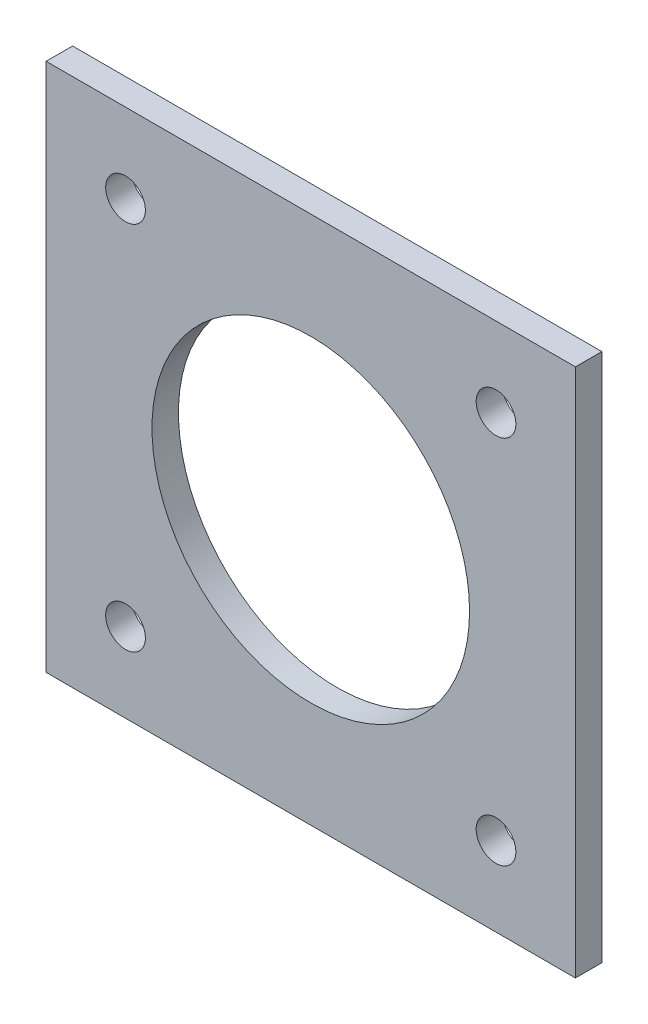
ISO-10303-21;
HEADER;
FILE_DESCRIPTION(('STEP AP214'),'2;1');
FILE_NAME('part.step','',(''),(''),'','','');
FILE_SCHEMA(('AUTOMOTIVE_DESIGN { 1 0 10303 214 1 1 1 1 }'));
ENDSEC;
DATA;
#1=APPLICATION_CONTEXT('core data for automotive mechanical design processes');
#2=APPLICATION_PROTOCOL_DEFINITION('international standard','automotive_design',2000,#1);
#3=PRODUCT_CONTEXT('',#1,'mechanical');
#4=PRODUCT('Part','Part','',(#3));
#5=PRODUCT_RELATED_PRODUCT_CATEGORY('part','',(#4));
#6=PRODUCT_DEFINITION_FORMATION('','',#4);
#7=PRODUCT_DEFINITION_CONTEXT('part definition',#1,'design');
#8=PRODUCT_DEFINITION('design','',#6,#7);
#9=PRODUCT_DEFINITION_SHAPE('','',#8);
#10=(LENGTH_UNIT() NAMED_UNIT(*) SI_UNIT(.MILLI.,.METRE.));
#11=(NAMED_UNIT(*) PLANE_ANGLE_UNIT() SI_UNIT($,.RADIAN.));
#12=(NAMED_UNIT(*) SI_UNIT($,.STERADIAN.) SOLID_ANGLE_UNIT());
#13=UNCERTAINTY_MEASURE_WITH_UNIT(LENGTH_MEASURE(1.E-05),#10,'distance_accuracy_value','');
#14=(GEOMETRIC_REPRESENTATION_CONTEXT(3) GLOBAL_UNCERTAINTY_ASSIGNED_CONTEXT((#13)) GLOBAL_UNIT_ASSIGNED_CONTEXT((#10,
#11,#12)) REPRESENTATION_CONTEXT('',''));
#15=CARTESIAN_POINT('',(0.,0.,0.));
#16=DIRECTION('',(0.,0.,1.));
#17=DIRECTION('',(1.,0.,0.));
#18=AXIS2_PLACEMENT_3D('',#15,#16,#17);
#19=CARTESIAN_POINT('',(-16.8432578160716,-11.7743628950051,2.));
#20=DIRECTION('',(0.,0.,1.));
#21=DIRECTION('',(1.,0.,0.));
#22=AXIS2_PLACEMENT_3D('',#19,#20,#21);
#23=PLANE('',#22);
#24=CARTESIAN_POINT('',(-10.8432578160716,-5.77436289500511,2.));
#25=DIRECTION('',(0.,0.,1.));
#26=DIRECTION('',(1.,0.,0.));
#27=AXIS2_PLACEMENT_3D('',#24,#25,#26);
#28=CIRCLE('',#27,1.5);
#29=CARTESIAN_POINT('',(-9.34325781607163,-5.77436289500511,2.));
#30=VERTEX_POINT('',#29);
#31=EDGE_CURVE('E125',#30,#30,#28,.T.);
#32=ORIENTED_EDGE('',*,*,#31,.F.);
#33=EDGE_LOOP('',(#32));
#34=FACE_BOUND('',#33,.T.);
#35=CARTESIAN_POINT('',(-10.8432578160716,22.2256371049949,2.));
#36=DIRECTION('',(0.,0.,1.));
#37=DIRECTION('',(1.,0.,0.));
#38=AXIS2_PLACEMENT_3D('',#35,#36,#37);
#39=CIRCLE('',#38,1.5);
#40=CARTESIAN_POINT('',(-9.34325781607162,22.2256371049949,2.));
#41=VERTEX_POINT('',#40);
#42=EDGE_CURVE('E113',#41,#41,#39,.T.);
#43=ORIENTED_EDGE('',*,*,#42,.F.);
#44=EDGE_LOOP('',(#43));
#45=FACE_BOUND('',#44,.T.);
#46=DIRECTION('',(0.,-1.,0.));
#47=VECTOR('',#46,1.);
#48=CARTESIAN_POINT('',(-16.8432578160716,28.2256371049949,2.));
#49=LINE('',#48,#47);
#50=CARTESIAN_POINT('',(-16.8432578160716,28.2256371049949,2.));
#51=VERTEX_POINT('',#50);
#52=CARTESIAN_POINT('',(-16.8432578160716,-11.7743628950051,2.));
#53=VERTEX_POINT('',#52);
#54=EDGE_CURVE('E83',#51,#53,#49,.T.);
#55=ORIENTED_EDGE('',*,*,#54,.T.);
#56=DIRECTION('',(1.,0.,0.));
#57=VECTOR('',#56,1.);
#58=CARTESIAN_POINT('',(-16.8432578160716,-11.7743628950051,2.));
#59=LINE('',#58,#57);
#60=CARTESIAN_POINT('',(23.1567421839284,-11.7743628950051,2.));
#61=VERTEX_POINT('',#60);
#62=EDGE_CURVE('E78',#53,#61,#59,.T.);
#63=ORIENTED_EDGE('',*,*,#62,.T.);
#64=DIRECTION('',(0.,1.,0.));
#65=VECTOR('',#64,1.);
#66=CARTESIAN_POINT('',(23.1567421839284,28.2256371049949,2.));
#67=LINE('',#66,#65);
#68=CARTESIAN_POINT('',(23.1567421839284,28.2256371049949,2.));
#69=VERTEX_POINT('',#68);
#70=EDGE_CURVE('E81',#61,#69,#67,.T.);
#71=ORIENTED_EDGE('',*,*,#70,.T.);
#72=DIRECTION('',(-1.,0.,0.));
#73=VECTOR('',#72,1.);
#74=CARTESIAN_POINT('',(-16.8432578160716,28.2256371049949,2.));
#75=LINE('',#74,#73);
#76=EDGE_CURVE('E48',#69,#51,#75,.T.);
#77=ORIENTED_EDGE('',*,*,#76,.T.);
#78=EDGE_LOOP('',(#55,#63,#71,#77));
#79=FACE_BOUND('',#78,.T.);
#80=CARTESIAN_POINT('',(3.15674218392838,8.22563710499489,2.));
#81=DIRECTION('',(0.,0.,1.));
#82=DIRECTION('',(1.,0.,0.));
#83=AXIS2_PLACEMENT_3D('',#80,#81,#82);
#84=CIRCLE('',#83,12.);
#85=CARTESIAN_POINT('',(15.1567421839284,8.22563710499489,2.));
#86=VERTEX_POINT('',#85);
#87=EDGE_CURVE('E98',#86,#86,#84,.T.);
#88=ORIENTED_EDGE('',*,*,#87,.F.);
#89=EDGE_LOOP('',(#88));
#90=FACE_BOUND('',#89,.T.);
#91=CARTESIAN_POINT('',(17.1567421839284,22.2256371049949,2.));
#92=DIRECTION('',(0.,0.,1.));
#93=DIRECTION('',(1.,0.,0.));
#94=AXIS2_PLACEMENT_3D('',#91,#92,#93);
#95=CIRCLE('',#94,1.5);
#96=CARTESIAN_POINT('',(18.6567421839284,22.2256371049949,2.));
#97=VERTEX_POINT('',#96);
#98=EDGE_CURVE('E119',#97,#97,#95,.T.);
#99=ORIENTED_EDGE('',*,*,#98,.F.);
#100=EDGE_LOOP('',(#99));
#101=FACE_BOUND('',#100,.T.);
#102=CARTESIAN_POINT('',(17.1567421839284,-5.77436289500511,2.));
#103=DIRECTION('',(0.,0.,1.));
#104=DIRECTION('',(1.,0.,0.));
#105=AXIS2_PLACEMENT_3D('',#102,#103,#104);
#106=CIRCLE('',#105,1.5);
#107=CARTESIAN_POINT('',(18.6567421839284,-5.77436289500511,2.));
#108=VERTEX_POINT('',#107);
#109=EDGE_CURVE('E131',#108,#108,#106,.T.);
#110=ORIENTED_EDGE('',*,*,#109,.F.);
#111=EDGE_LOOP('',(#110));
#112=FACE_BOUND('',#111,.T.);
#113=ADVANCED_FACE('F31',(#34,#45,#79,#90,#101,#112),#23,.T.);
#114=CARTESIAN_POINT('',(-16.8432578160716,-11.7743628950051,0.));
#115=DIRECTION('',(0.,0.,1.));
#116=DIRECTION('',(1.,0.,0.));
#117=AXIS2_PLACEMENT_3D('',#114,#115,#116);
#118=PLANE('',#117);
#119=CARTESIAN_POINT('',(-10.8432578160716,-5.77436289500511,0.));
#120=DIRECTION('',(0.,0.,1.));
#121=DIRECTION('',(1.,0.,0.));
#122=AXIS2_PLACEMENT_3D('',#119,#120,#121);
#123=CIRCLE('',#122,1.5);
#124=CARTESIAN_POINT('',(-9.34325781607163,-5.77436289500511,0.));
#125=VERTEX_POINT('',#124);
#126=EDGE_CURVE('E128',#125,#125,#123,.T.);
#127=ORIENTED_EDGE('',*,*,#126,.T.);
#128=EDGE_LOOP('',(#127));
#129=FACE_BOUND('',#128,.T.);
#130=CARTESIAN_POINT('',(-10.8432578160716,22.2256371049949,0.));
#131=DIRECTION('',(0.,0.,1.));
#132=DIRECTION('',(1.,0.,0.));
#133=AXIS2_PLACEMENT_3D('',#130,#131,#132);
#134=CIRCLE('',#133,1.5);
#135=CARTESIAN_POINT('',(-9.34325781607162,22.2256371049949,0.));
#136=VERTEX_POINT('',#135);
#137=EDGE_CURVE('E116',#136,#136,#134,.T.);
#138=ORIENTED_EDGE('',*,*,#137,.T.);
#139=EDGE_LOOP('',(#138));
#140=FACE_BOUND('',#139,.T.);
#141=DIRECTION('',(0.,-1.,0.));
#142=VECTOR('',#141,1.);
#143=CARTESIAN_POINT('',(-16.8432578160716,28.2256371049949,0.));
#144=LINE('',#143,#142);
#145=CARTESIAN_POINT('',(-16.8432578160716,28.2256371049949,0.));
#146=VERTEX_POINT('',#145);
#147=CARTESIAN_POINT('',(-16.8432578160716,-11.7743628950051,0.));
#148=VERTEX_POINT('',#147);
#149=EDGE_CURVE('E95',#146,#148,#144,.T.);
#150=ORIENTED_EDGE('',*,*,#149,.F.);
#151=DIRECTION('',(-1.,0.,0.));
#152=VECTOR('',#151,1.);
#153=CARTESIAN_POINT('',(-16.8432578160716,28.2256371049949,0.));
#154=LINE('',#153,#152);
#155=CARTESIAN_POINT('',(23.1567421839284,28.2256371049949,0.));
#156=VERTEX_POINT('',#155);
#157=EDGE_CURVE('E71',#156,#146,#154,.T.);
#158=ORIENTED_EDGE('',*,*,#157,.F.);
#159=DIRECTION('',(0.,1.,0.));
#160=VECTOR('',#159,1.);
#161=CARTESIAN_POINT('',(23.1567421839284,28.2256371049949,0.));
#162=LINE('',#161,#160);
#163=CARTESIAN_POINT('',(23.1567421839284,-11.7743628950051,0.));
#164=VERTEX_POINT('',#163);
#165=EDGE_CURVE('E65',#164,#156,#162,.T.);
#166=ORIENTED_EDGE('',*,*,#165,.F.);
#167=DIRECTION('',(1.,0.,0.));
#168=VECTOR('',#167,1.);
#169=CARTESIAN_POINT('',(-16.8432578160716,-11.7743628950051,0.));
#170=LINE('',#169,#168);
#171=EDGE_CURVE('E87',#148,#164,#170,.T.);
#172=ORIENTED_EDGE('',*,*,#171,.F.);
#173=EDGE_LOOP('',(#150,#158,#166,#172));
#174=FACE_BOUND('',#173,.T.);
#175=CARTESIAN_POINT('',(3.15674218392838,8.22563710499489,0.));
#176=DIRECTION('',(0.,0.,1.));
#177=DIRECTION('',(1.,0.,0.));
#178=AXIS2_PLACEMENT_3D('',#175,#176,#177);
#179=CIRCLE('',#178,12.);
#180=CARTESIAN_POINT('',(15.1567421839284,8.22563710499489,0.));
#181=VERTEX_POINT('',#180);
#182=EDGE_CURVE('E110',#181,#181,#179,.T.);
#183=ORIENTED_EDGE('',*,*,#182,.T.);
#184=EDGE_LOOP('',(#183));
#185=FACE_BOUND('',#184,.T.);
#186=CARTESIAN_POINT('',(17.1567421839284,22.2256371049949,0.));
#187=DIRECTION('',(0.,0.,1.));
#188=DIRECTION('',(1.,0.,0.));
#189=AXIS2_PLACEMENT_3D('',#186,#187,#188);
#190=CIRCLE('',#189,1.5);
#191=CARTESIAN_POINT('',(18.6567421839284,22.2256371049949,0.));
#192=VERTEX_POINT('',#191);
#193=EDGE_CURVE('E122',#192,#192,#190,.T.);
#194=ORIENTED_EDGE('',*,*,#193,.T.);
#195=EDGE_LOOP('',(#194));
#196=FACE_BOUND('',#195,.T.);
#197=CARTESIAN_POINT('',(17.1567421839284,-5.77436289500511,0.));
#198=DIRECTION('',(0.,0.,1.));
#199=DIRECTION('',(1.,0.,0.));
#200=AXIS2_PLACEMENT_3D('',#197,#198,#199);
#201=CIRCLE('',#200,1.5);
#202=CARTESIAN_POINT('',(18.6567421839284,-5.77436289500511,0.));
#203=VERTEX_POINT('',#202);
#204=EDGE_CURVE('E134',#203,#203,#201,.T.);
#205=ORIENTED_EDGE('',*,*,#204,.T.);
#206=EDGE_LOOP('',(#205));
#207=FACE_BOUND('',#206,.T.);
#208=ADVANCED_FACE('F106',(#129,#140,#174,#185,#196,#207),#118,.F.);
#209=CARTESIAN_POINT('',(-16.8432578160716,28.2256371049949,2.));
#210=DIRECTION('',(1.,0.,0.));
#211=DIRECTION('',(0.,1.,0.));
#212=AXIS2_PLACEMENT_3D('',#209,#210,#211);
#213=PLANE('',#212);
#214=ORIENTED_EDGE('',*,*,#149,.T.);
#215=DIRECTION('',(0.,0.,-1.));
#216=VECTOR('',#215,1.);
#217=CARTESIAN_POINT('',(-16.8432578160716,-11.7743628950051,2.));
#218=LINE('',#217,#216);
#219=EDGE_CURVE('E11',#53,#148,#218,.T.);
#220=ORIENTED_EDGE('',*,*,#219,.F.);
#221=ORIENTED_EDGE('',*,*,#54,.F.);
#222=DIRECTION('',(0.,0.,-1.));
#223=VECTOR('',#222,1.);
#224=CARTESIAN_POINT('',(-16.8432578160716,28.2256371049949,2.));
#225=LINE('',#224,#223);
#226=EDGE_CURVE('E91',#51,#146,#225,.T.);
#227=ORIENTED_EDGE('',*,*,#226,.T.);
#228=EDGE_LOOP('',(#214,#220,#221,#227));
#229=FACE_BOUND('',#228,.T.);
#230=ADVANCED_FACE('F33',(#229),#213,.F.);
#231=CARTESIAN_POINT('',(-16.8432578160716,-11.7743628950051,2.));
#232=DIRECTION('',(0.,1.,0.));
#233=DIRECTION('',(0.,0.,1.));
#234=AXIS2_PLACEMENT_3D('',#231,#232,#233);
#235=PLANE('',#234);
#236=ORIENTED_EDGE('',*,*,#171,.T.);
#237=DIRECTION('',(0.,0.,-1.));
#238=VECTOR('',#237,1.);
#239=CARTESIAN_POINT('',(23.1567421839284,-11.7743628950051,2.));
#240=LINE('',#239,#238);
#241=EDGE_CURVE('E40',#61,#164,#240,.T.);
#242=ORIENTED_EDGE('',*,*,#241,.F.);
#243=ORIENTED_EDGE('',*,*,#62,.F.);
#244=ORIENTED_EDGE('',*,*,#219,.T.);
#245=EDGE_LOOP('',(#236,#242,#243,#244));
#246=FACE_BOUND('',#245,.T.);
#247=ADVANCED_FACE('F86',(#246),#235,.F.);
#248=CARTESIAN_POINT('',(23.1567421839284,28.2256371049949,2.));
#249=DIRECTION('',(-1.,0.,0.));
#250=DIRECTION('',(0.,-1.,0.));
#251=AXIS2_PLACEMENT_3D('',#248,#249,#250);
#252=PLANE('',#251);
#253=ORIENTED_EDGE('',*,*,#165,.T.);
#254=DIRECTION('',(0.,0.,-1.));
#255=VECTOR('',#254,1.);
#256=CARTESIAN_POINT('',(23.1567421839284,28.2256371049949,2.));
#257=LINE('',#256,#255);
#258=EDGE_CURVE('E88',#69,#156,#257,.T.);
#259=ORIENTED_EDGE('',*,*,#258,.F.);
#260=ORIENTED_EDGE('',*,*,#70,.F.);
#261=ORIENTED_EDGE('',*,*,#241,.T.);
#262=EDGE_LOOP('',(#253,#259,#260,#261));
#263=FACE_BOUND('',#262,.T.);
#264=ADVANCED_FACE('F89',(#263),#252,.F.);
#265=CARTESIAN_POINT('',(-16.8432578160716,28.2256371049949,2.));
#266=DIRECTION('',(0.,-1.,0.));
#267=DIRECTION('',(0.,0.,-1.));
#268=AXIS2_PLACEMENT_3D('',#265,#266,#267);
#269=PLANE('',#268);
#270=ORIENTED_EDGE('',*,*,#157,.T.);
#271=ORIENTED_EDGE('',*,*,#226,.F.);
#272=ORIENTED_EDGE('',*,*,#76,.F.);
#273=ORIENTED_EDGE('',*,*,#258,.T.);
#274=EDGE_LOOP('',(#270,#271,#272,#273));
#275=FACE_BOUND('',#274,.T.);
#276=ADVANCED_FACE('F103',(#275),#269,.F.);
#277=CARTESIAN_POINT('',(3.15674218392838,8.22563710499489,2.));
#278=DIRECTION('',(0.,0.,-1.));
#279=DIRECTION('',(-1.,0.,0.));
#280=AXIS2_PLACEMENT_3D('',#277,#278,#279);
#281=CYLINDRICAL_SURFACE('',#280,12.);
#282=ORIENTED_EDGE('',*,*,#87,.T.);
#283=EDGE_LOOP('',(#282));
#284=FACE_BOUND('',#283,.T.);
#285=ORIENTED_EDGE('',*,*,#182,.F.);
#286=EDGE_LOOP('',(#285));
#287=FACE_BOUND('',#286,.T.);
#288=ADVANCED_FACE('F154',(#284,#287),#281,.F.);
#289=CARTESIAN_POINT('',(-10.8432578160716,22.2256371049949,2.));
#290=DIRECTION('',(0.,0.,-1.));
#291=DIRECTION('',(-1.,0.,0.));
#292=AXIS2_PLACEMENT_3D('',#289,#290,#291);
#293=CYLINDRICAL_SURFACE('',#292,1.5);
#294=ORIENTED_EDGE('',*,*,#42,.T.);
#295=EDGE_LOOP('',(#294));
#296=FACE_BOUND('',#295,.T.);
#297=ORIENTED_EDGE('',*,*,#137,.F.);
#298=EDGE_LOOP('',(#297));
#299=FACE_BOUND('',#298,.T.);
#300=ADVANCED_FACE('F200',(#296,#299),#293,.F.);
#301=CARTESIAN_POINT('',(17.1567421839284,22.2256371049949,2.));
#302=DIRECTION('',(0.,0.,-1.));
#303=DIRECTION('',(-1.,0.,0.));
#304=AXIS2_PLACEMENT_3D('',#301,#302,#303);
#305=CYLINDRICAL_SURFACE('',#304,1.5);
#306=ORIENTED_EDGE('',*,*,#98,.T.);
#307=EDGE_LOOP('',(#306));
#308=FACE_BOUND('',#307,.T.);
#309=ORIENTED_EDGE('',*,*,#193,.F.);
#310=EDGE_LOOP('',(#309));
#311=FACE_BOUND('',#310,.T.);
#312=ADVANCED_FACE('F208',(#308,#311),#305,.F.);
#313=CARTESIAN_POINT('',(-10.8432578160716,-5.77436289500511,2.));
#314=DIRECTION('',(0.,0.,-1.));
#315=DIRECTION('',(-1.,0.,0.));
#316=AXIS2_PLACEMENT_3D('',#313,#314,#315);
#317=CYLINDRICAL_SURFACE('',#316,1.5);
#318=ORIENTED_EDGE('',*,*,#31,.T.);
#319=EDGE_LOOP('',(#318));
#320=FACE_BOUND('',#319,.T.);
#321=ORIENTED_EDGE('',*,*,#126,.F.);
#322=EDGE_LOOP('',(#321));
#323=FACE_BOUND('',#322,.T.);
#324=ADVANCED_FACE('F216',(#320,#323),#317,.F.);
#325=CARTESIAN_POINT('',(17.1567421839284,-5.77436289500511,2.));
#326=DIRECTION('',(0.,0.,-1.));
#327=DIRECTION('',(-1.,0.,0.));
#328=AXIS2_PLACEMENT_3D('',#325,#326,#327);
#329=CYLINDRICAL_SURFACE('',#328,1.5);
#330=ORIENTED_EDGE('',*,*,#109,.T.);
#331=EDGE_LOOP('',(#330));
#332=FACE_BOUND('',#331,.T.);
#333=ORIENTED_EDGE('',*,*,#204,.F.);
#334=EDGE_LOOP('',(#333));
#335=FACE_BOUND('',#334,.T.);
#336=ADVANCED_FACE('F140',(#332,#335),#329,.F.);
#337=CLOSED_SHELL('',(#113,#208,#230,#247,#264,#276,#288,#300,#312,#324,#336));
#338=MANIFOLD_SOLID_BREP('B2',#337);
#339=ADVANCED_BREP_SHAPE_REPRESENTATION('',(#18,#338),#14);
#340=SHAPE_DEFINITION_REPRESENTATION(#9,#339);
ENDSEC;
END-ISO-10303-21;
